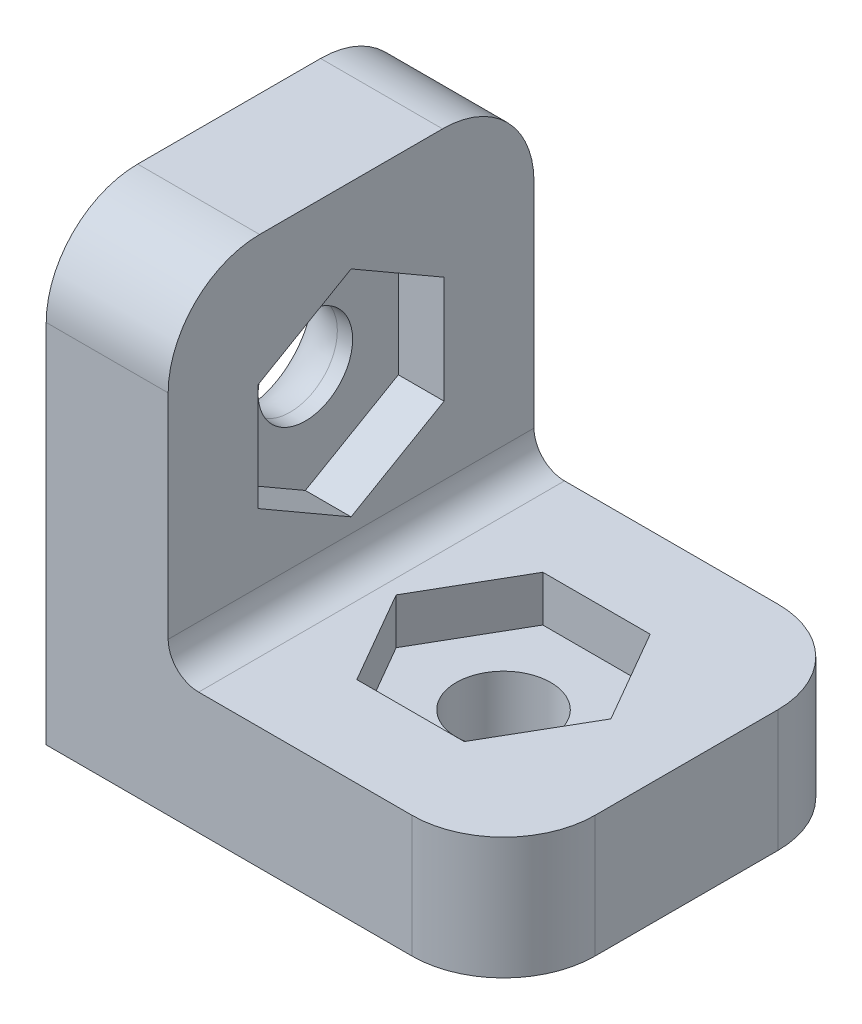
ISO-10303-21;
HEADER;
FILE_DESCRIPTION(('STEP AP214'),'2;1');
FILE_NAME('part.step','',(''),(''),'','','');
FILE_SCHEMA(('AUTOMOTIVE_DESIGN { 1 0 10303 214 1 1 1 1 }'));
ENDSEC;
DATA;
#1=APPLICATION_CONTEXT('core data for automotive mechanical design processes');
#2=APPLICATION_PROTOCOL_DEFINITION('international standard','automotive_design',2000,#1);
#3=PRODUCT_CONTEXT('',#1,'mechanical');
#4=PRODUCT('Part','Part','',(#3));
#5=PRODUCT_RELATED_PRODUCT_CATEGORY('part','',(#4));
#6=PRODUCT_DEFINITION_FORMATION('','',#4);
#7=PRODUCT_DEFINITION_CONTEXT('part definition',#1,'design');
#8=PRODUCT_DEFINITION('design','',#6,#7);
#9=PRODUCT_DEFINITION_SHAPE('','',#8);
#10=(LENGTH_UNIT() NAMED_UNIT(*) SI_UNIT(.MILLI.,.METRE.));
#11=(NAMED_UNIT(*) PLANE_ANGLE_UNIT() SI_UNIT($,.RADIAN.));
#12=(NAMED_UNIT(*) SI_UNIT($,.STERADIAN.) SOLID_ANGLE_UNIT());
#13=UNCERTAINTY_MEASURE_WITH_UNIT(LENGTH_MEASURE(1.E-05),#10,'distance_accuracy_value','');
#14=(GEOMETRIC_REPRESENTATION_CONTEXT(3) GLOBAL_UNCERTAINTY_ASSIGNED_CONTEXT((#13)) GLOBAL_UNIT_ASSIGNED_CONTEXT((#10,
#11,#12)) REPRESENTATION_CONTEXT('',''));
#15=CARTESIAN_POINT('',(0.,0.,0.));
#16=DIRECTION('',(0.,0.,1.));
#17=DIRECTION('',(1.,0.,0.));
#18=AXIS2_PLACEMENT_3D('',#15,#16,#17);
#19=CARTESIAN_POINT('',(0.,9.,6.));
#20=DIRECTION('',(1.,0.,0.));
#21=DIRECTION('',(0.,1.,0.));
#22=AXIS2_PLACEMENT_3D('',#19,#20,#21);
#23=CYLINDRICAL_SURFACE('',#22,1.55);
#24=CARTESIAN_POINT('',(2.,9.,6.));
#25=DIRECTION('',(1.,0.,0.));
#26=DIRECTION('',(0.,0.,-1.));
#27=AXIS2_PLACEMENT_3D('',#24,#25,#26);
#28=CIRCLE('',#27,1.55);
#29=CARTESIAN_POINT('',(2.,9.,4.45));
#30=VERTEX_POINT('',#29);
#31=EDGE_CURVE('E340',#30,#30,#28,.F.);
#32=ORIENTED_EDGE('',*,*,#31,.T.);
#33=EDGE_LOOP('',(#32));
#34=FACE_BOUND('',#33,.T.);
#35=CARTESIAN_POINT('',(2.5,9.,6.));
#36=DIRECTION('',(1.,0.,0.));
#37=DIRECTION('',(0.,0.,-1.));
#38=AXIS2_PLACEMENT_3D('',#35,#36,#37);
#39=CIRCLE('',#38,1.55);
#40=CARTESIAN_POINT('',(2.5,9.,4.45));
#41=VERTEX_POINT('',#40);
#42=EDGE_CURVE('E240',#41,#41,#39,.F.);
#43=ORIENTED_EDGE('',*,*,#42,.F.);
#44=EDGE_LOOP('',(#43));
#45=FACE_BOUND('',#44,.T.);
#46=ADVANCED_FACE('F33',(#34,#45),#23,.F.);
#47=CARTESIAN_POINT('',(9.,0.,6.));
#48=DIRECTION('',(0.,1.,0.));
#49=DIRECTION('',(0.,0.,1.));
#50=AXIS2_PLACEMENT_3D('',#47,#48,#49);
#51=CYLINDRICAL_SURFACE('',#50,1.55);
#52=CARTESIAN_POINT('',(9.,0.,6.));
#53=DIRECTION('',(0.,1.,0.));
#54=DIRECTION('',(0.,0.,1.));
#55=AXIS2_PLACEMENT_3D('',#52,#53,#54);
#56=CIRCLE('',#55,1.55);
#57=CARTESIAN_POINT('',(9.,0.,7.55));
#58=VERTEX_POINT('',#57);
#59=EDGE_CURVE('E297',#58,#58,#56,.T.);
#60=ORIENTED_EDGE('',*,*,#59,.F.);
#61=EDGE_LOOP('',(#60));
#62=FACE_BOUND('',#61,.T.);
#63=CARTESIAN_POINT('',(9.,2.5,6.));
#64=DIRECTION('',(0.,1.,0.));
#65=DIRECTION('',(0.,0.,1.));
#66=AXIS2_PLACEMENT_3D('',#63,#64,#65);
#67=CIRCLE('',#66,1.55);
#68=CARTESIAN_POINT('',(9.,2.5,7.55));
#69=VERTEX_POINT('',#68);
#70=EDGE_CURVE('E286',#69,#69,#67,.F.);
#71=ORIENTED_EDGE('',*,*,#70,.F.);
#72=EDGE_LOOP('',(#71));
#73=FACE_BOUND('',#72,.T.);
#74=ADVANCED_FACE('F417',(#62,#73),#51,.F.);
#75=CARTESIAN_POINT('',(15.,0.,12.));
#76=DIRECTION('',(0.,1.,0.));
#77=DIRECTION('',(-1.,0.,0.));
#78=AXIS2_PLACEMENT_3D('',#75,#76,#77);
#79=PLANE('',#78);
#80=ORIENTED_EDGE('',*,*,#59,.T.);
#81=EDGE_LOOP('',(#80));
#82=FACE_BOUND('',#81,.T.);
#83=DIRECTION('',(1.,0.,0.));
#84=VECTOR('',#83,1.);
#85=CARTESIAN_POINT('',(15.,0.,0.));
#86=LINE('',#85,#84);
#87=CARTESIAN_POINT('',(0.,0.,0.));
#88=VERTEX_POINT('',#87);
#89=CARTESIAN_POINT('',(12.,0.,0.));
#90=VERTEX_POINT('',#89);
#91=EDGE_CURVE('E300',#88,#90,#86,.T.);
#92=ORIENTED_EDGE('',*,*,#91,.T.);
#93=CARTESIAN_POINT('',(12.,0.,3.));
#94=DIRECTION('',(0.,1.,0.));
#95=DIRECTION('',(-1.,0.,0.));
#96=AXIS2_PLACEMENT_3D('',#93,#94,#95);
#97=CIRCLE('',#96,3.);
#98=CARTESIAN_POINT('',(15.,0.,3.));
#99=VERTEX_POINT('',#98);
#100=EDGE_CURVE('E369',#90,#99,#97,.F.);
#101=ORIENTED_EDGE('',*,*,#100,.T.);
#102=DIRECTION('',(0.,0.,-1.));
#103=VECTOR('',#102,1.);
#104=CARTESIAN_POINT('',(15.,0.,12.));
#105=LINE('',#104,#103);
#106=CARTESIAN_POINT('',(15.,0.,9.));
#107=VERTEX_POINT('',#106);
#108=EDGE_CURVE('E330',#107,#99,#105,.T.);
#109=ORIENTED_EDGE('',*,*,#108,.F.);
#110=CARTESIAN_POINT('',(12.,0.,9.));
#111=DIRECTION('',(0.,1.,0.));
#112=DIRECTION('',(-1.,0.,0.));
#113=AXIS2_PLACEMENT_3D('',#110,#111,#112);
#114=CIRCLE('',#113,3.);
#115=CARTESIAN_POINT('',(12.,0.,12.));
#116=VERTEX_POINT('',#115);
#117=EDGE_CURVE('E367',#107,#116,#114,.F.);
#118=ORIENTED_EDGE('',*,*,#117,.T.);
#119=DIRECTION('',(1.,0.,0.));
#120=VECTOR('',#119,1.);
#121=CARTESIAN_POINT('',(15.,0.,12.));
#122=LINE('',#121,#120);
#123=CARTESIAN_POINT('',(0.,0.,12.));
#124=VERTEX_POINT('',#123);
#125=EDGE_CURVE('E301',#124,#116,#122,.T.);
#126=ORIENTED_EDGE('',*,*,#125,.F.);
#127=DIRECTION('',(0.,0.,-1.));
#128=VECTOR('',#127,1.);
#129=CARTESIAN_POINT('',(0.,0.,12.));
#130=LINE('',#129,#128);
#131=EDGE_CURVE('E312',#124,#88,#130,.T.);
#132=ORIENTED_EDGE('',*,*,#131,.T.);
#133=EDGE_LOOP('',(#92,#101,#109,#118,#126,#132));
#134=FACE_BOUND('',#133,.T.);
#135=ADVANCED_FACE('F423',(#82,#134),#79,.F.);
#136=CARTESIAN_POINT('',(15.,4.,12.));
#137=DIRECTION('',(-1.,0.,0.));
#138=DIRECTION('',(0.,0.,1.));
#139=AXIS2_PLACEMENT_3D('',#136,#137,#138);
#140=PLANE('',#139);
#141=ORIENTED_EDGE('',*,*,#108,.T.);
#142=DIRECTION('',(0.,1.,0.));
#143=VECTOR('',#142,1.);
#144=CARTESIAN_POINT('',(15.,4.,3.));
#145=LINE('',#144,#143);
#146=CARTESIAN_POINT('',(15.,4.,3.));
#147=VERTEX_POINT('',#146);
#148=EDGE_CURVE('E356',#99,#147,#145,.T.);
#149=ORIENTED_EDGE('',*,*,#148,.T.);
#150=DIRECTION('',(0.,0.,-1.));
#151=VECTOR('',#150,1.);
#152=CARTESIAN_POINT('',(15.,4.,12.));
#153=LINE('',#152,#151);
#154=CARTESIAN_POINT('',(15.,4.,9.));
#155=VERTEX_POINT('',#154);
#156=EDGE_CURVE('E327',#155,#147,#153,.T.);
#157=ORIENTED_EDGE('',*,*,#156,.F.);
#158=DIRECTION('',(0.,1.,0.));
#159=VECTOR('',#158,1.);
#160=CARTESIAN_POINT('',(15.,4.,9.));
#161=LINE('',#160,#159);
#162=EDGE_CURVE('E354',#155,#107,#161,.F.);
#163=ORIENTED_EDGE('',*,*,#162,.T.);
#164=EDGE_LOOP('',(#141,#149,#157,#163));
#165=FACE_BOUND('',#164,.T.);
#166=ADVANCED_FACE('F473',(#165),#140,.F.);
#167=CARTESIAN_POINT('',(4.,4.,12.));
#168=DIRECTION('',(0.,-1.,0.));
#169=DIRECTION('',(0.,0.,-1.));
#170=AXIS2_PLACEMENT_3D('',#167,#168,#169);
#171=PLANE('',#170);
#172=DIRECTION('',(0.5,0.,0.866025403784439));
#173=VECTOR('',#172,1.);
#174=CARTESIAN_POINT('',(5.47816335794328,4.,6.));
#175=LINE('',#174,#173);
#176=CARTESIAN_POINT('',(5.47816335794328,4.,6.));
#177=VERTEX_POINT('',#176);
#178=CARTESIAN_POINT('',(7.23908167897164,4.,9.05));
#179=VERTEX_POINT('',#178);
#180=EDGE_CURVE('E270',#177,#179,#175,.T.);
#181=ORIENTED_EDGE('',*,*,#180,.F.);
#182=DIRECTION('',(-0.5,0.,0.866025403784439));
#183=VECTOR('',#182,1.);
#184=CARTESIAN_POINT('',(7.23908167897164,4.,2.95));
#185=LINE('',#184,#183);
#186=CARTESIAN_POINT('',(7.23908167897164,4.,2.95));
#187=VERTEX_POINT('',#186);
#188=EDGE_CURVE('E268',#187,#177,#185,.T.);
#189=ORIENTED_EDGE('',*,*,#188,.F.);
#190=DIRECTION('',(-1.,0.,0.));
#191=VECTOR('',#190,1.);
#192=CARTESIAN_POINT('',(10.7609183210284,4.,2.95));
#193=LINE('',#192,#191);
#194=CARTESIAN_POINT('',(10.7609183210284,4.,2.95));
#195=VERTEX_POINT('',#194);
#196=EDGE_CURVE('E252',#195,#187,#193,.T.);
#197=ORIENTED_EDGE('',*,*,#196,.F.);
#198=DIRECTION('',(-0.5,0.,-0.866025403784438));
#199=VECTOR('',#198,1.);
#200=CARTESIAN_POINT('',(12.5218366420567,4.,6.));
#201=LINE('',#200,#199);
#202=CARTESIAN_POINT('',(12.5218366420567,4.,6.));
#203=VERTEX_POINT('',#202);
#204=EDGE_CURVE('E279',#203,#195,#201,.T.);
#205=ORIENTED_EDGE('',*,*,#204,.F.);
#206=DIRECTION('',(0.5,0.,-0.866025403784439));
#207=VECTOR('',#206,1.);
#208=CARTESIAN_POINT('',(10.7609183210284,4.,9.05));
#209=LINE('',#208,#207);
#210=CARTESIAN_POINT('',(10.7609183210284,4.,9.05));
#211=VERTEX_POINT('',#210);
#212=EDGE_CURVE('E276',#211,#203,#209,.T.);
#213=ORIENTED_EDGE('',*,*,#212,.F.);
#214=DIRECTION('',(1.,0.,0.));
#215=VECTOR('',#214,1.);
#216=CARTESIAN_POINT('',(7.23908167897164,4.,9.05));
#217=LINE('',#216,#215);
#218=EDGE_CURVE('E273',#179,#211,#217,.T.);
#219=ORIENTED_EDGE('',*,*,#218,.F.);
#220=EDGE_LOOP('',(#181,#189,#197,#205,#213,#219));
#221=FACE_BOUND('',#220,.T.);
#222=ORIENTED_EDGE('',*,*,#156,.T.);
#223=CARTESIAN_POINT('',(12.,4.,3.));
#224=DIRECTION('',(0.,-1.,0.));
#225=DIRECTION('',(0.,0.,-1.));
#226=AXIS2_PLACEMENT_3D('',#223,#224,#225);
#227=CIRCLE('',#226,3.);
#228=CARTESIAN_POINT('',(12.,4.,0.));
#229=VERTEX_POINT('',#228);
#230=EDGE_CURVE('E361',#147,#229,#227,.F.);
#231=ORIENTED_EDGE('',*,*,#230,.T.);
#232=DIRECTION('',(-1.,0.,0.));
#233=VECTOR('',#232,1.);
#234=CARTESIAN_POINT('',(4.,4.,0.));
#235=LINE('',#234,#233);
#236=CARTESIAN_POINT('',(5.,4.,0.));
#237=VERTEX_POINT('',#236);
#238=EDGE_CURVE('E315',#229,#237,#235,.T.);
#239=ORIENTED_EDGE('',*,*,#238,.T.);
#240=DIRECTION('',(0.,0.,-1.));
#241=VECTOR('',#240,1.);
#242=CARTESIAN_POINT('',(5.,4.,12.));
#243=LINE('',#242,#241);
#244=CARTESIAN_POINT('',(5.,4.,12.));
#245=VERTEX_POINT('',#244);
#246=EDGE_CURVE('E346',#237,#245,#243,.F.);
#247=ORIENTED_EDGE('',*,*,#246,.T.);
#248=DIRECTION('',(-1.,0.,0.));
#249=VECTOR('',#248,1.);
#250=CARTESIAN_POINT('',(4.,4.,12.));
#251=LINE('',#250,#249);
#252=CARTESIAN_POINT('',(12.,4.,12.));
#253=VERTEX_POINT('',#252);
#254=EDGE_CURVE('E304',#253,#245,#251,.T.);
#255=ORIENTED_EDGE('',*,*,#254,.F.);
#256=CARTESIAN_POINT('',(12.,4.,9.));
#257=DIRECTION('',(0.,-1.,0.));
#258=DIRECTION('',(0.,0.,-1.));
#259=AXIS2_PLACEMENT_3D('',#256,#257,#258);
#260=CIRCLE('',#259,3.);
#261=EDGE_CURVE('E359',#253,#155,#260,.F.);
#262=ORIENTED_EDGE('',*,*,#261,.T.);
#263=EDGE_LOOP('',(#222,#231,#239,#247,#255,#262));
#264=FACE_BOUND('',#263,.T.);
#265=ADVANCED_FACE('F469',(#221,#264),#171,.F.);
#266=CARTESIAN_POINT('',(4.,15.,12.));
#267=DIRECTION('',(-1.,0.,0.));
#268=DIRECTION('',(0.,-1.,0.));
#269=AXIS2_PLACEMENT_3D('',#266,#267,#268);
#270=PLANE('',#269);
#271=DIRECTION('',(0.,0.5,-0.866025403784439));
#272=VECTOR('',#271,1.);
#273=CARTESIAN_POINT('',(4.,5.47816335794325,6.));
#274=LINE('',#273,#272);
#275=CARTESIAN_POINT('',(4.,5.47816335794325,6.));
#276=VERTEX_POINT('',#275);
#277=CARTESIAN_POINT('',(4.,7.23908167897163,2.94999999999997));
#278=VERTEX_POINT('',#277);
#279=EDGE_CURVE('E228',#276,#278,#274,.T.);
#280=ORIENTED_EDGE('',*,*,#279,.F.);
#281=DIRECTION('',(0.,-0.5,-0.866025403784439));
#282=VECTOR('',#281,1.);
#283=CARTESIAN_POINT('',(4.,7.23908167897163,9.05000000000002));
#284=LINE('',#283,#282);
#285=CARTESIAN_POINT('',(4.,7.23908167897163,9.05000000000002));
#286=VERTEX_POINT('',#285);
#287=EDGE_CURVE('E195',#286,#276,#284,.T.);
#288=ORIENTED_EDGE('',*,*,#287,.F.);
#289=DIRECTION('',(0.,-1.,0.));
#290=VECTOR('',#289,1.);
#291=CARTESIAN_POINT('',(4.,10.7609183210284,9.05000000000002));
#292=LINE('',#291,#290);
#293=CARTESIAN_POINT('',(4.,10.7609183210284,9.05000000000002));
#294=VERTEX_POINT('',#293);
#295=EDGE_CURVE('E214',#294,#286,#292,.T.);
#296=ORIENTED_EDGE('',*,*,#295,.F.);
#297=DIRECTION('',(0.,-0.5,0.866025403784439));
#298=VECTOR('',#297,1.);
#299=CARTESIAN_POINT('',(4.,12.5218366420567,6.));
#300=LINE('',#299,#298);
#301=CARTESIAN_POINT('',(4.,12.5218366420567,6.));
#302=VERTEX_POINT('',#301);
#303=EDGE_CURVE('E217',#302,#294,#300,.T.);
#304=ORIENTED_EDGE('',*,*,#303,.F.);
#305=DIRECTION('',(0.,0.5,0.866025403784438));
#306=VECTOR('',#305,1.);
#307=CARTESIAN_POINT('',(4.,10.7609183210284,2.94999999999997));
#308=LINE('',#307,#306);
#309=CARTESIAN_POINT('',(4.,10.7609183210284,2.94999999999997));
#310=VERTEX_POINT('',#309);
#311=EDGE_CURVE('E233',#310,#302,#308,.T.);
#312=ORIENTED_EDGE('',*,*,#311,.F.);
#313=DIRECTION('',(0.,1.,0.));
#314=VECTOR('',#313,1.);
#315=CARTESIAN_POINT('',(4.,7.23908167897163,2.94999999999997));
#316=LINE('',#315,#314);
#317=EDGE_CURVE('E230',#278,#310,#316,.T.);
#318=ORIENTED_EDGE('',*,*,#317,.F.);
#319=EDGE_LOOP('',(#280,#288,#296,#304,#312,#318));
#320=FACE_BOUND('',#319,.T.);
#321=DIRECTION('',(0.,0.,-1.));
#322=VECTOR('',#321,1.);
#323=CARTESIAN_POINT('',(4.,15.,12.));
#324=LINE('',#323,#322);
#325=CARTESIAN_POINT('',(4.,15.,9.));
#326=VERTEX_POINT('',#325);
#327=CARTESIAN_POINT('',(4.,15.,3.));
#328=VERTEX_POINT('',#327);
#329=EDGE_CURVE('E325',#326,#328,#324,.T.);
#330=ORIENTED_EDGE('',*,*,#329,.F.);
#331=CARTESIAN_POINT('',(4.,12.,9.));
#332=DIRECTION('',(-1.,0.,0.));
#333=DIRECTION('',(0.,-1.,0.));
#334=AXIS2_PLACEMENT_3D('',#331,#332,#333);
#335=CIRCLE('',#334,3.);
#336=CARTESIAN_POINT('',(4.,12.,12.));
#337=VERTEX_POINT('',#336);
#338=EDGE_CURVE('E11',#326,#337,#335,.F.);
#339=ORIENTED_EDGE('',*,*,#338,.T.);
#340=DIRECTION('',(0.,1.,0.));
#341=VECTOR('',#340,1.);
#342=CARTESIAN_POINT('',(4.,15.,12.));
#343=LINE('',#342,#341);
#344=CARTESIAN_POINT('',(4.,5.,12.));
#345=VERTEX_POINT('',#344);
#346=EDGE_CURVE('E307',#345,#337,#343,.T.);
#347=ORIENTED_EDGE('',*,*,#346,.F.);
#348=DIRECTION('',(0.,0.,-1.));
#349=VECTOR('',#348,1.);
#350=CARTESIAN_POINT('',(4.,5.,0.));
#351=LINE('',#350,#349);
#352=CARTESIAN_POINT('',(4.,5.,0.));
#353=VERTEX_POINT('',#352);
#354=EDGE_CURVE('E343',#345,#353,#351,.T.);
#355=ORIENTED_EDGE('',*,*,#354,.T.);
#356=DIRECTION('',(0.,1.,0.));
#357=VECTOR('',#356,1.);
#358=CARTESIAN_POINT('',(4.,15.,0.));
#359=LINE('',#358,#357);
#360=CARTESIAN_POINT('',(4.,12.,0.));
#361=VERTEX_POINT('',#360);
#362=EDGE_CURVE('E317',#353,#361,#359,.T.);
#363=ORIENTED_EDGE('',*,*,#362,.T.);
#364=CARTESIAN_POINT('',(4.,12.,3.));
#365=DIRECTION('',(-1.,0.,0.));
#366=DIRECTION('',(0.,-1.,0.));
#367=AXIS2_PLACEMENT_3D('',#364,#365,#366);
#368=CIRCLE('',#367,3.);
#369=EDGE_CURVE('E41',#361,#328,#368,.F.);
#370=ORIENTED_EDGE('',*,*,#369,.T.);
#371=EDGE_LOOP('',(#330,#339,#347,#355,#363,#370));
#372=FACE_BOUND('',#371,.T.);
#373=ADVANCED_FACE('F401',(#320,#372),#270,.F.);
#374=CARTESIAN_POINT('',(0.,15.,12.));
#375=DIRECTION('',(0.,-1.,0.));
#376=DIRECTION('',(0.,0.,-1.));
#377=AXIS2_PLACEMENT_3D('',#374,#375,#376);
#378=PLANE('',#377);
#379=DIRECTION('',(0.,0.,-1.));
#380=VECTOR('',#379,1.);
#381=CARTESIAN_POINT('',(0.,15.,12.));
#382=LINE('',#381,#380);
#383=CARTESIAN_POINT('',(0.,15.,9.));
#384=VERTEX_POINT('',#383);
#385=CARTESIAN_POINT('',(0.,15.,3.));
#386=VERTEX_POINT('',#385);
#387=EDGE_CURVE('E322',#384,#386,#382,.T.);
#388=ORIENTED_EDGE('',*,*,#387,.F.);
#389=DIRECTION('',(-1.,0.,0.));
#390=VECTOR('',#389,1.);
#391=CARTESIAN_POINT('',(0.,15.,9.));
#392=LINE('',#391,#390);
#393=EDGE_CURVE('E54',#384,#326,#392,.F.);
#394=ORIENTED_EDGE('',*,*,#393,.T.);
#395=ORIENTED_EDGE('',*,*,#329,.T.);
#396=DIRECTION('',(-1.,0.,0.));
#397=VECTOR('',#396,1.);
#398=CARTESIAN_POINT('',(0.,15.,3.));
#399=LINE('',#398,#397);
#400=EDGE_CURVE('E381',#328,#386,#399,.T.);
#401=ORIENTED_EDGE('',*,*,#400,.T.);
#402=EDGE_LOOP('',(#388,#394,#395,#401));
#403=FACE_BOUND('',#402,.T.);
#404=ADVANCED_FACE('F385',(#403),#378,.F.);
#405=CARTESIAN_POINT('',(0.,0.,12.));
#406=DIRECTION('',(1.,0.,0.));
#407=DIRECTION('',(0.,0.,-1.));
#408=AXIS2_PLACEMENT_3D('',#405,#406,#407);
#409=PLANE('',#408);
#410=CARTESIAN_POINT('',(0.,9.,6.));
#411=DIRECTION('',(1.,0.,0.));
#412=DIRECTION('',(0.,0.,-1.));
#413=AXIS2_PLACEMENT_3D('',#410,#411,#412);
#414=CIRCLE('',#413,3.55);
#415=CARTESIAN_POINT('',(0.,9.,2.45));
#416=VERTEX_POINT('',#415);
#417=EDGE_CURVE('E333',#416,#416,#414,.T.);
#418=ORIENTED_EDGE('',*,*,#417,.T.);
#419=EDGE_LOOP('',(#418));
#420=FACE_BOUND('',#419,.T.);
#421=DIRECTION('',(0.,-1.,0.));
#422=VECTOR('',#421,1.);
#423=CARTESIAN_POINT('',(0.,0.,12.));
#424=LINE('',#423,#422);
#425=CARTESIAN_POINT('',(0.,12.,12.));
#426=VERTEX_POINT('',#425);
#427=EDGE_CURVE('E310',#426,#124,#424,.T.);
#428=ORIENTED_EDGE('',*,*,#427,.F.);
#429=CARTESIAN_POINT('',(0.,12.,9.));
#430=DIRECTION('',(1.,0.,0.));
#431=DIRECTION('',(0.,0.,-1.));
#432=AXIS2_PLACEMENT_3D('',#429,#430,#431);
#433=CIRCLE('',#432,3.);
#434=EDGE_CURVE('E379',#426,#384,#433,.F.);
#435=ORIENTED_EDGE('',*,*,#434,.T.);
#436=ORIENTED_EDGE('',*,*,#387,.T.);
#437=CARTESIAN_POINT('',(0.,12.,3.));
#438=DIRECTION('',(1.,0.,0.));
#439=DIRECTION('',(0.,0.,-1.));
#440=AXIS2_PLACEMENT_3D('',#437,#438,#439);
#441=CIRCLE('',#440,3.);
#442=CARTESIAN_POINT('',(0.,12.,0.));
#443=VERTEX_POINT('',#442);
#444=EDGE_CURVE('E377',#386,#443,#441,.F.);
#445=ORIENTED_EDGE('',*,*,#444,.T.);
#446=DIRECTION('',(0.,-1.,0.));
#447=VECTOR('',#446,1.);
#448=CARTESIAN_POINT('',(0.,0.,0.));
#449=LINE('',#448,#447);
#450=EDGE_CURVE('E305',#443,#88,#449,.T.);
#451=ORIENTED_EDGE('',*,*,#450,.T.);
#452=ORIENTED_EDGE('',*,*,#131,.F.);
#453=EDGE_LOOP('',(#428,#435,#436,#445,#451,#452));
#454=FACE_BOUND('',#453,.T.);
#455=ADVANCED_FACE('F389',(#420,#454),#409,.F.);
#456=CARTESIAN_POINT('',(0.,0.,12.));
#457=DIRECTION('',(0.,0.,-1.));
#458=DIRECTION('',(-1.,0.,0.));
#459=AXIS2_PLACEMENT_3D('',#456,#457,#458);
#460=PLANE('',#459);
#461=ORIENTED_EDGE('',*,*,#125,.T.);
#462=DIRECTION('',(0.,1.,0.));
#463=VECTOR('',#462,1.);
#464=CARTESIAN_POINT('',(12.,0.,12.));
#465=LINE('',#464,#463);
#466=EDGE_CURVE('E374',#116,#253,#465,.T.);
#467=ORIENTED_EDGE('',*,*,#466,.T.);
#468=ORIENTED_EDGE('',*,*,#254,.T.);
#469=CARTESIAN_POINT('',(5.,5.,12.));
#470=DIRECTION('',(0.,0.,-1.));
#471=DIRECTION('',(-1.,0.,0.));
#472=AXIS2_PLACEMENT_3D('',#469,#470,#471);
#473=CIRCLE('',#472,1.);
#474=EDGE_CURVE('E352',#245,#345,#473,.T.);
#475=ORIENTED_EDGE('',*,*,#474,.T.);
#476=ORIENTED_EDGE('',*,*,#346,.T.);
#477=DIRECTION('',(-1.,0.,0.));
#478=VECTOR('',#477,1.);
#479=CARTESIAN_POINT('',(0.,12.,12.));
#480=LINE('',#479,#478);
#481=EDGE_CURVE('E371',#337,#426,#480,.T.);
#482=ORIENTED_EDGE('',*,*,#481,.T.);
#483=ORIENTED_EDGE('',*,*,#427,.T.);
#484=EDGE_LOOP('',(#461,#467,#468,#475,#476,#482,#483));
#485=FACE_BOUND('',#484,.T.);
#486=ADVANCED_FACE('F397',(#485),#460,.F.);
#487=CARTESIAN_POINT('',(0.,0.,0.));
#488=DIRECTION('',(0.,0.,-1.));
#489=DIRECTION('',(-1.,0.,0.));
#490=AXIS2_PLACEMENT_3D('',#487,#488,#489);
#491=PLANE('',#490);
#492=ORIENTED_EDGE('',*,*,#238,.F.);
#493=DIRECTION('',(0.,1.,0.));
#494=VECTOR('',#493,1.);
#495=CARTESIAN_POINT('',(12.,0.,0.));
#496=LINE('',#495,#494);
#497=EDGE_CURVE('E365',#229,#90,#496,.F.);
#498=ORIENTED_EDGE('',*,*,#497,.T.);
#499=ORIENTED_EDGE('',*,*,#91,.F.);
#500=ORIENTED_EDGE('',*,*,#450,.F.);
#501=DIRECTION('',(-1.,0.,0.));
#502=VECTOR('',#501,1.);
#503=CARTESIAN_POINT('',(4.,12.,0.));
#504=LINE('',#503,#502);
#505=EDGE_CURVE('E363',#443,#361,#504,.F.);
#506=ORIENTED_EDGE('',*,*,#505,.T.);
#507=ORIENTED_EDGE('',*,*,#362,.F.);
#508=CARTESIAN_POINT('',(5.,5.,0.));
#509=DIRECTION('',(0.,0.,-1.));
#510=DIRECTION('',(-1.,0.,0.));
#511=AXIS2_PLACEMENT_3D('',#508,#509,#510);
#512=CIRCLE('',#511,1.);
#513=EDGE_CURVE('E349',#353,#237,#512,.F.);
#514=ORIENTED_EDGE('',*,*,#513,.T.);
#515=EDGE_LOOP('',(#492,#498,#499,#500,#506,#507,#514));
#516=FACE_BOUND('',#515,.T.);
#517=ADVANCED_FACE('F408',(#516),#491,.T.);
#518=CARTESIAN_POINT('',(0.,2.5,0.));
#519=DIRECTION('',(0.,1.,0.));
#520=DIRECTION('',(0.,0.,1.));
#521=AXIS2_PLACEMENT_3D('',#518,#519,#520);
#522=PLANE('',#521);
#523=DIRECTION('',(-0.5,0.,0.866025403784439));
#524=VECTOR('',#523,1.);
#525=CARTESIAN_POINT('',(7.23908167897164,2.5,2.95));
#526=LINE('',#525,#524);
#527=CARTESIAN_POINT('',(7.23908167897164,2.5,2.95));
#528=VERTEX_POINT('',#527);
#529=CARTESIAN_POINT('',(5.47816335794328,2.5,6.));
#530=VERTEX_POINT('',#529);
#531=EDGE_CURVE('E248',#528,#530,#526,.T.);
#532=ORIENTED_EDGE('',*,*,#531,.T.);
#533=DIRECTION('',(0.5,0.,0.866025403784439));
#534=VECTOR('',#533,1.);
#535=CARTESIAN_POINT('',(5.47816335794328,2.5,6.));
#536=LINE('',#535,#534);
#537=CARTESIAN_POINT('',(7.23908167897164,2.5,9.05));
#538=VERTEX_POINT('',#537);
#539=EDGE_CURVE('E251',#530,#538,#536,.T.);
#540=ORIENTED_EDGE('',*,*,#539,.T.);
#541=DIRECTION('',(1.,0.,0.));
#542=VECTOR('',#541,1.);
#543=CARTESIAN_POINT('',(7.23908167897164,2.5,9.05));
#544=LINE('',#543,#542);
#545=CARTESIAN_POINT('',(10.7609183210284,2.5,9.05));
#546=VERTEX_POINT('',#545);
#547=EDGE_CURVE('E255',#538,#546,#544,.T.);
#548=ORIENTED_EDGE('',*,*,#547,.T.);
#549=DIRECTION('',(0.5,0.,-0.866025403784439));
#550=VECTOR('',#549,1.);
#551=CARTESIAN_POINT('',(10.7609183210284,2.5,9.05));
#552=LINE('',#551,#550);
#553=CARTESIAN_POINT('',(12.5218366420567,2.5,6.));
#554=VERTEX_POINT('',#553);
#555=EDGE_CURVE('E258',#546,#554,#552,.T.);
#556=ORIENTED_EDGE('',*,*,#555,.T.);
#557=DIRECTION('',(-0.5,0.,-0.866025403784438));
#558=VECTOR('',#557,1.);
#559=CARTESIAN_POINT('',(12.5218366420567,2.5,6.));
#560=LINE('',#559,#558);
#561=CARTESIAN_POINT('',(10.7609183210284,2.5,2.95));
#562=VERTEX_POINT('',#561);
#563=EDGE_CURVE('E261',#554,#562,#560,.T.);
#564=ORIENTED_EDGE('',*,*,#563,.T.);
#565=DIRECTION('',(-1.,0.,0.));
#566=VECTOR('',#565,1.);
#567=CARTESIAN_POINT('',(10.7609183210284,2.5,2.95));
#568=LINE('',#567,#566);
#569=EDGE_CURVE('E264',#562,#528,#568,.T.);
#570=ORIENTED_EDGE('',*,*,#569,.T.);
#571=EDGE_LOOP('',(#532,#540,#548,#556,#564,#570));
#572=FACE_BOUND('',#571,.T.);
#573=ORIENTED_EDGE('',*,*,#70,.T.);
#574=EDGE_LOOP('',(#573));
#575=FACE_BOUND('',#574,.T.);
#576=ADVANCED_FACE('F430',(#572,#575),#522,.T.);
#577=CARTESIAN_POINT('',(7.23908167897164,2.5,2.95));
#578=DIRECTION('',(-0.866025403784439,0.,-0.5));
#579=DIRECTION('',(-0.5,0.,0.866025403784439));
#580=AXIS2_PLACEMENT_3D('',#577,#578,#579);
#581=PLANE('',#580);
#582=ORIENTED_EDGE('',*,*,#188,.T.);
#583=DIRECTION('',(0.,1.,0.));
#584=VECTOR('',#583,1.);
#585=CARTESIAN_POINT('',(5.47816335794328,2.5,6.));
#586=LINE('',#585,#584);
#587=EDGE_CURVE('E267',#530,#177,#586,.T.);
#588=ORIENTED_EDGE('',*,*,#587,.F.);
#589=ORIENTED_EDGE('',*,*,#531,.F.);
#590=DIRECTION('',(0.,1.,0.));
#591=VECTOR('',#590,1.);
#592=CARTESIAN_POINT('',(7.23908167897164,2.5,2.95));
#593=LINE('',#592,#591);
#594=EDGE_CURVE('E284',#528,#187,#593,.T.);
#595=ORIENTED_EDGE('',*,*,#594,.T.);
#596=EDGE_LOOP('',(#582,#588,#589,#595));
#597=FACE_BOUND('',#596,.T.);
#598=ADVANCED_FACE('F433',(#597),#581,.F.);
#599=CARTESIAN_POINT('',(10.7609183210284,2.5,2.95));
#600=DIRECTION('',(0.,0.,-1.));
#601=DIRECTION('',(-1.,0.,0.));
#602=AXIS2_PLACEMENT_3D('',#599,#600,#601);
#603=PLANE('',#602);
#604=ORIENTED_EDGE('',*,*,#196,.T.);
#605=ORIENTED_EDGE('',*,*,#594,.F.);
#606=ORIENTED_EDGE('',*,*,#569,.F.);
#607=DIRECTION('',(0.,1.,0.));
#608=VECTOR('',#607,1.);
#609=CARTESIAN_POINT('',(10.7609183210284,2.5,2.95));
#610=LINE('',#609,#608);
#611=EDGE_CURVE('E287',#562,#195,#610,.T.);
#612=ORIENTED_EDGE('',*,*,#611,.T.);
#613=EDGE_LOOP('',(#604,#605,#606,#612));
#614=FACE_BOUND('',#613,.T.);
#615=ADVANCED_FACE('F435',(#614),#603,.F.);
#616=CARTESIAN_POINT('',(12.5218366420567,2.5,6.));
#617=DIRECTION('',(0.866025403784439,0.,-0.5));
#618=DIRECTION('',(-0.5,0.,-0.866025403784439));
#619=AXIS2_PLACEMENT_3D('',#616,#617,#618);
#620=PLANE('',#619);
#621=ORIENTED_EDGE('',*,*,#204,.T.);
#622=ORIENTED_EDGE('',*,*,#611,.F.);
#623=ORIENTED_EDGE('',*,*,#563,.F.);
#624=DIRECTION('',(0.,1.,0.));
#625=VECTOR('',#624,1.);
#626=CARTESIAN_POINT('',(12.5218366420567,2.5,6.));
#627=LINE('',#626,#625);
#628=EDGE_CURVE('E289',#554,#203,#627,.T.);
#629=ORIENTED_EDGE('',*,*,#628,.T.);
#630=EDGE_LOOP('',(#621,#622,#623,#629));
#631=FACE_BOUND('',#630,.T.);
#632=ADVANCED_FACE('F438',(#631),#620,.F.);
#633=CARTESIAN_POINT('',(10.7609183210284,2.5,9.05));
#634=DIRECTION('',(0.866025403784439,0.,0.5));
#635=DIRECTION('',(0.5,0.,-0.866025403784439));
#636=AXIS2_PLACEMENT_3D('',#633,#634,#635);
#637=PLANE('',#636);
#638=ORIENTED_EDGE('',*,*,#212,.T.);
#639=ORIENTED_EDGE('',*,*,#628,.F.);
#640=ORIENTED_EDGE('',*,*,#555,.F.);
#641=DIRECTION('',(0.,1.,0.));
#642=VECTOR('',#641,1.);
#643=CARTESIAN_POINT('',(10.7609183210284,2.5,9.05));
#644=LINE('',#643,#642);
#645=EDGE_CURVE('E291',#546,#211,#644,.T.);
#646=ORIENTED_EDGE('',*,*,#645,.T.);
#647=EDGE_LOOP('',(#638,#639,#640,#646));
#648=FACE_BOUND('',#647,.T.);
#649=ADVANCED_FACE('F442',(#648),#637,.F.);
#650=CARTESIAN_POINT('',(7.23908167897164,2.5,9.05));
#651=DIRECTION('',(0.,0.,1.));
#652=DIRECTION('',(1.,0.,0.));
#653=AXIS2_PLACEMENT_3D('',#650,#651,#652);
#654=PLANE('',#653);
#655=ORIENTED_EDGE('',*,*,#218,.T.);
#656=ORIENTED_EDGE('',*,*,#645,.F.);
#657=ORIENTED_EDGE('',*,*,#547,.F.);
#658=DIRECTION('',(0.,1.,0.));
#659=VECTOR('',#658,1.);
#660=CARTESIAN_POINT('',(7.23908167897164,2.5,9.05));
#661=LINE('',#660,#659);
#662=EDGE_CURVE('E293',#538,#179,#661,.T.);
#663=ORIENTED_EDGE('',*,*,#662,.T.);
#664=EDGE_LOOP('',(#655,#656,#657,#663));
#665=FACE_BOUND('',#664,.T.);
#666=ADVANCED_FACE('F446',(#665),#654,.F.);
#667=CARTESIAN_POINT('',(5.47816335794328,2.5,6.));
#668=DIRECTION('',(-0.866025403784439,0.,0.5));
#669=DIRECTION('',(0.5,0.,0.866025403784439));
#670=AXIS2_PLACEMENT_3D('',#667,#668,#669);
#671=PLANE('',#670);
#672=ORIENTED_EDGE('',*,*,#180,.T.);
#673=ORIENTED_EDGE('',*,*,#662,.F.);
#674=ORIENTED_EDGE('',*,*,#539,.F.);
#675=ORIENTED_EDGE('',*,*,#587,.T.);
#676=EDGE_LOOP('',(#672,#673,#674,#675));
#677=FACE_BOUND('',#676,.T.);
#678=ADVANCED_FACE('F450',(#677),#671,.F.);
#679=CARTESIAN_POINT('',(2.5,0.,0.));
#680=DIRECTION('',(1.,0.,0.));
#681=DIRECTION('',(0.,0.,-1.));
#682=AXIS2_PLACEMENT_3D('',#679,#680,#681);
#683=PLANE('',#682);
#684=DIRECTION('',(0.,-0.5,-0.866025403784439));
#685=VECTOR('',#684,1.);
#686=CARTESIAN_POINT('',(2.5,7.23908167897163,9.05000000000002));
#687=LINE('',#686,#685);
#688=CARTESIAN_POINT('',(2.5,7.23908167897163,9.05000000000002));
#689=VERTEX_POINT('',#688);
#690=CARTESIAN_POINT('',(2.5,5.47816335794325,6.));
#691=VERTEX_POINT('',#690);
#692=EDGE_CURVE('E192',#689,#691,#687,.T.);
#693=ORIENTED_EDGE('',*,*,#692,.T.);
#694=DIRECTION('',(0.,0.5,-0.866025403784439));
#695=VECTOR('',#694,1.);
#696=CARTESIAN_POINT('',(2.5,5.47816335794325,6.));
#697=LINE('',#696,#695);
#698=CARTESIAN_POINT('',(2.5,7.23908167897163,2.94999999999997));
#699=VERTEX_POINT('',#698);
#700=EDGE_CURVE('E203',#691,#699,#697,.T.);
#701=ORIENTED_EDGE('',*,*,#700,.T.);
#702=DIRECTION('',(0.,1.,0.));
#703=VECTOR('',#702,1.);
#704=CARTESIAN_POINT('',(2.5,7.23908167897163,2.94999999999997));
#705=LINE('',#704,#703);
#706=CARTESIAN_POINT('',(2.5,10.7609183210284,2.94999999999997));
#707=VERTEX_POINT('',#706);
#708=EDGE_CURVE('E208',#699,#707,#705,.T.);
#709=ORIENTED_EDGE('',*,*,#708,.T.);
#710=DIRECTION('',(0.,0.5,0.866025403784438));
#711=VECTOR('',#710,1.);
#712=CARTESIAN_POINT('',(2.5,10.7609183210284,2.94999999999997));
#713=LINE('',#712,#711);
#714=CARTESIAN_POINT('',(2.5,12.5218366420567,6.));
#715=VERTEX_POINT('',#714);
#716=EDGE_CURVE('E221',#707,#715,#713,.T.);
#717=ORIENTED_EDGE('',*,*,#716,.T.);
#718=DIRECTION('',(0.,-0.5,0.866025403784439));
#719=VECTOR('',#718,1.);
#720=CARTESIAN_POINT('',(2.5,12.5218366420567,6.));
#721=LINE('',#720,#719);
#722=CARTESIAN_POINT('',(2.5,10.7609183210284,9.05000000000002));
#723=VERTEX_POINT('',#722);
#724=EDGE_CURVE('E224',#715,#723,#721,.T.);
#725=ORIENTED_EDGE('',*,*,#724,.T.);
#726=DIRECTION('',(0.,-1.,0.));
#727=VECTOR('',#726,1.);
#728=CARTESIAN_POINT('',(2.5,10.7609183210284,9.05000000000002));
#729=LINE('',#728,#727);
#730=EDGE_CURVE('E200',#723,#689,#729,.T.);
#731=ORIENTED_EDGE('',*,*,#730,.T.);
#732=EDGE_LOOP('',(#693,#701,#709,#717,#725,#731));
#733=FACE_BOUND('',#732,.T.);
#734=ORIENTED_EDGE('',*,*,#42,.T.);
#735=EDGE_LOOP('',(#734));
#736=FACE_BOUND('',#735,.T.);
#737=ADVANCED_FACE('F210',(#733,#736),#683,.T.);
#738=CARTESIAN_POINT('',(2.5,7.23908167897163,9.05000000000002));
#739=DIRECTION('',(0.,-0.866025403784439,0.5));
#740=DIRECTION('',(0.,-0.5,-0.866025403784439));
#741=AXIS2_PLACEMENT_3D('',#738,#739,#740);
#742=PLANE('',#741);
#743=ORIENTED_EDGE('',*,*,#287,.T.);
#744=DIRECTION('',(1.,0.,0.));
#745=VECTOR('',#744,1.);
#746=CARTESIAN_POINT('',(2.5,5.47816335794325,6.));
#747=LINE('',#746,#745);
#748=EDGE_CURVE('E188',#691,#276,#747,.T.);
#749=ORIENTED_EDGE('',*,*,#748,.F.);
#750=ORIENTED_EDGE('',*,*,#692,.F.);
#751=DIRECTION('',(1.,0.,0.));
#752=VECTOR('',#751,1.);
#753=CARTESIAN_POINT('',(2.5,7.23908167897163,9.05000000000002));
#754=LINE('',#753,#752);
#755=EDGE_CURVE('E238',#689,#286,#754,.T.);
#756=ORIENTED_EDGE('',*,*,#755,.T.);
#757=EDGE_LOOP('',(#743,#749,#750,#756));
#758=FACE_BOUND('',#757,.T.);
#759=ADVANCED_FACE('F190',(#758),#742,.F.);
#760=CARTESIAN_POINT('',(2.5,10.7609183210284,9.05000000000002));
#761=DIRECTION('',(0.,0.,1.));
#762=DIRECTION('',(1.,0.,0.));
#763=AXIS2_PLACEMENT_3D('',#760,#761,#762);
#764=PLANE('',#763);
#765=ORIENTED_EDGE('',*,*,#295,.T.);
#766=ORIENTED_EDGE('',*,*,#755,.F.);
#767=ORIENTED_EDGE('',*,*,#730,.F.);
#768=DIRECTION('',(1.,0.,0.));
#769=VECTOR('',#768,1.);
#770=CARTESIAN_POINT('',(2.5,10.7609183210284,9.05000000000002));
#771=LINE('',#770,#769);
#772=EDGE_CURVE('E241',#723,#294,#771,.T.);
#773=ORIENTED_EDGE('',*,*,#772,.T.);
#774=EDGE_LOOP('',(#765,#766,#767,#773));
#775=FACE_BOUND('',#774,.T.);
#776=ADVANCED_FACE('F570',(#775),#764,.F.);
#777=CARTESIAN_POINT('',(2.5,12.5218366420567,6.));
#778=DIRECTION('',(0.,0.866025403784438,0.5));
#779=DIRECTION('',(0.,-0.5,0.866025403784439));
#780=AXIS2_PLACEMENT_3D('',#777,#778,#779);
#781=PLANE('',#780);
#782=ORIENTED_EDGE('',*,*,#303,.T.);
#783=ORIENTED_EDGE('',*,*,#772,.F.);
#784=ORIENTED_EDGE('',*,*,#724,.F.);
#785=DIRECTION('',(1.,0.,0.));
#786=VECTOR('',#785,1.);
#787=CARTESIAN_POINT('',(2.5,12.5218366420567,6.));
#788=LINE('',#787,#786);
#789=EDGE_CURVE('E243',#715,#302,#788,.T.);
#790=ORIENTED_EDGE('',*,*,#789,.T.);
#791=EDGE_LOOP('',(#782,#783,#784,#790));
#792=FACE_BOUND('',#791,.T.);
#793=ADVANCED_FACE('F561',(#792),#781,.F.);
#794=CARTESIAN_POINT('',(2.5,10.7609183210284,2.94999999999997));
#795=DIRECTION('',(0.,0.866025403784439,-0.5));
#796=DIRECTION('',(0.,0.5,0.866025403784439));
#797=AXIS2_PLACEMENT_3D('',#794,#795,#796);
#798=PLANE('',#797);
#799=ORIENTED_EDGE('',*,*,#311,.T.);
#800=ORIENTED_EDGE('',*,*,#789,.F.);
#801=ORIENTED_EDGE('',*,*,#716,.F.);
#802=DIRECTION('',(1.,0.,0.));
#803=VECTOR('',#802,1.);
#804=CARTESIAN_POINT('',(2.5,10.7609183210284,2.94999999999997));
#805=LINE('',#804,#803);
#806=EDGE_CURVE('E245',#707,#310,#805,.T.);
#807=ORIENTED_EDGE('',*,*,#806,.T.);
#808=EDGE_LOOP('',(#799,#800,#801,#807));
#809=FACE_BOUND('',#808,.T.);
#810=ADVANCED_FACE('F552',(#809),#798,.F.);
#811=CARTESIAN_POINT('',(2.5,7.23908167897163,2.94999999999997));
#812=DIRECTION('',(0.,0.,-1.));
#813=DIRECTION('',(-1.,0.,0.));
#814=AXIS2_PLACEMENT_3D('',#811,#812,#813);
#815=PLANE('',#814);
#816=ORIENTED_EDGE('',*,*,#317,.T.);
#817=ORIENTED_EDGE('',*,*,#806,.F.);
#818=ORIENTED_EDGE('',*,*,#708,.F.);
#819=DIRECTION('',(1.,0.,0.));
#820=VECTOR('',#819,1.);
#821=CARTESIAN_POINT('',(2.5,7.23908167897163,2.94999999999997));
#822=LINE('',#821,#820);
#823=EDGE_CURVE('E199',#699,#278,#822,.T.);
#824=ORIENTED_EDGE('',*,*,#823,.T.);
#825=EDGE_LOOP('',(#816,#817,#818,#824));
#826=FACE_BOUND('',#825,.T.);
#827=ADVANCED_FACE('F545',(#826),#815,.F.);
#828=CARTESIAN_POINT('',(2.5,5.47816335794325,6.));
#829=DIRECTION('',(0.,-0.866025403784438,-0.5));
#830=DIRECTION('',(0.,0.5,-0.866025403784439));
#831=AXIS2_PLACEMENT_3D('',#828,#829,#830);
#832=PLANE('',#831);
#833=ORIENTED_EDGE('',*,*,#279,.T.);
#834=ORIENTED_EDGE('',*,*,#823,.F.);
#835=ORIENTED_EDGE('',*,*,#700,.F.);
#836=ORIENTED_EDGE('',*,*,#748,.T.);
#837=EDGE_LOOP('',(#833,#834,#835,#836));
#838=FACE_BOUND('',#837,.T.);
#839=ADVANCED_FACE('F204',(#838),#832,.F.);
#840=CARTESIAN_POINT('',(2.,9.,6.));
#841=DIRECTION('',(1.,0.,0.));
#842=DIRECTION('',(0.,0.,-1.));
#843=AXIS2_PLACEMENT_3D('',#840,#841,#842);
#844=TOROIDAL_SURFACE('',#843,3.55,2.);
#845=ORIENTED_EDGE('',*,*,#31,.F.);
#846=EDGE_LOOP('',(#845));
#847=FACE_BOUND('',#846,.T.);
#848=ORIENTED_EDGE('',*,*,#417,.F.);
#849=EDGE_LOOP('',(#848));
#850=FACE_BOUND('',#849,.T.);
#851=ADVANCED_FACE('F481',(#847,#850),#844,.T.);
#852=CARTESIAN_POINT('',(5.,5.,12.));
#853=DIRECTION('',(0.,0.,1.));
#854=DIRECTION('',(1.,0.,0.));
#855=AXIS2_PLACEMENT_3D('',#852,#853,#854);
#856=CYLINDRICAL_SURFACE('',#855,1.);
#857=ORIENTED_EDGE('',*,*,#474,.F.);
#858=ORIENTED_EDGE('',*,*,#246,.F.);
#859=ORIENTED_EDGE('',*,*,#513,.F.);
#860=ORIENTED_EDGE('',*,*,#354,.F.);
#861=EDGE_LOOP('',(#857,#858,#859,#860));
#862=FACE_BOUND('',#861,.T.);
#863=ADVANCED_FACE('F404',(#862),#856,.F.);
#864=CARTESIAN_POINT('',(12.,4.,3.));
#865=DIRECTION('',(0.,-1.,0.));
#866=DIRECTION('',(0.,0.,-1.));
#867=AXIS2_PLACEMENT_3D('',#864,#865,#866);
#868=CYLINDRICAL_SURFACE('',#867,3.);
#869=ORIENTED_EDGE('',*,*,#100,.F.);
#870=ORIENTED_EDGE('',*,*,#497,.F.);
#871=ORIENTED_EDGE('',*,*,#230,.F.);
#872=ORIENTED_EDGE('',*,*,#148,.F.);
#873=EDGE_LOOP('',(#869,#870,#871,#872));
#874=FACE_BOUND('',#873,.T.);
#875=ADVANCED_FACE('F487',(#874),#868,.T.);
#876=CARTESIAN_POINT('',(12.,0.,9.));
#877=DIRECTION('',(0.,1.,0.));
#878=DIRECTION('',(0.,0.,1.));
#879=AXIS2_PLACEMENT_3D('',#876,#877,#878);
#880=CYLINDRICAL_SURFACE('',#879,3.);
#881=ORIENTED_EDGE('',*,*,#117,.F.);
#882=ORIENTED_EDGE('',*,*,#162,.F.);
#883=ORIENTED_EDGE('',*,*,#261,.F.);
#884=ORIENTED_EDGE('',*,*,#466,.F.);
#885=EDGE_LOOP('',(#881,#882,#883,#884));
#886=FACE_BOUND('',#885,.T.);
#887=ADVANCED_FACE('F415',(#886),#880,.T.);
#888=CARTESIAN_POINT('',(0.,12.,9.));
#889=DIRECTION('',(-1.,0.,0.));
#890=DIRECTION('',(0.,0.,1.));
#891=AXIS2_PLACEMENT_3D('',#888,#889,#890);
#892=CYLINDRICAL_SURFACE('',#891,3.);
#893=ORIENTED_EDGE('',*,*,#338,.F.);
#894=ORIENTED_EDGE('',*,*,#393,.F.);
#895=ORIENTED_EDGE('',*,*,#434,.F.);
#896=ORIENTED_EDGE('',*,*,#481,.F.);
#897=EDGE_LOOP('',(#893,#894,#895,#896));
#898=FACE_BOUND('',#897,.T.);
#899=ADVANCED_FACE('F395',(#898),#892,.T.);
#900=CARTESIAN_POINT('',(0.,12.,3.));
#901=DIRECTION('',(1.,0.,0.));
#902=DIRECTION('',(0.,0.,-1.));
#903=AXIS2_PLACEMENT_3D('',#900,#901,#902);
#904=CYLINDRICAL_SURFACE('',#903,3.);
#905=ORIENTED_EDGE('',*,*,#369,.F.);
#906=ORIENTED_EDGE('',*,*,#505,.F.);
#907=ORIENTED_EDGE('',*,*,#444,.F.);
#908=ORIENTED_EDGE('',*,*,#400,.F.);
#909=EDGE_LOOP('',(#905,#906,#907,#908));
#910=FACE_BOUND('',#909,.T.);
#911=ADVANCED_FACE('F35',(#910),#904,.T.);
#912=CLOSED_SHELL('',(#46,#74,#135,#166,#265,#373,#404,#455,#486,#517,#576,#598,#615,#632,#649,
#666,#678,#737,#759,#776,#793,#810,#827,#839,#851,#863,#875,#887,#899,#911));
#913=MANIFOLD_SOLID_BREP('B2',#912);
#914=ADVANCED_BREP_SHAPE_REPRESENTATION('',(#18,#913),#14);
#915=SHAPE_DEFINITION_REPRESENTATION(#9,#914);
ENDSEC;
END-ISO-10303-21;
